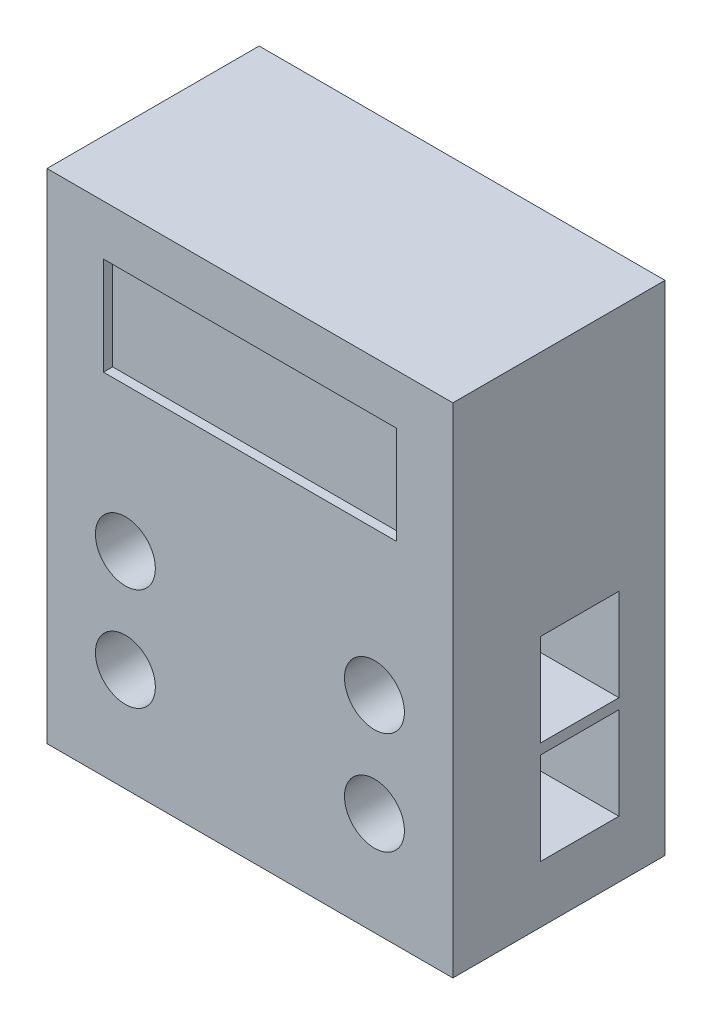
ISO-10303-21;
HEADER;
FILE_DESCRIPTION(('STEP AP214'),'2;1');
FILE_NAME('part.step','',(''),(''),'','','');
FILE_SCHEMA(('AUTOMOTIVE_DESIGN { 1 0 10303 214 1 1 1 1 }'));
ENDSEC;
DATA;
#1=APPLICATION_CONTEXT('core data for automotive mechanical design processes');
#2=APPLICATION_PROTOCOL_DEFINITION('international standard','automotive_design',2000,#1);
#3=PRODUCT_CONTEXT('',#1,'mechanical');
#4=PRODUCT('Part','Part','',(#3));
#5=PRODUCT_RELATED_PRODUCT_CATEGORY('part','',(#4));
#6=PRODUCT_DEFINITION_FORMATION('','',#4);
#7=PRODUCT_DEFINITION_CONTEXT('part definition',#1,'design');
#8=PRODUCT_DEFINITION('design','',#6,#7);
#9=PRODUCT_DEFINITION_SHAPE('','',#8);
#10=(LENGTH_UNIT() NAMED_UNIT(*) SI_UNIT(.MILLI.,.METRE.));
#11=(NAMED_UNIT(*) PLANE_ANGLE_UNIT() SI_UNIT($,.RADIAN.));
#12=(NAMED_UNIT(*) SI_UNIT($,.STERADIAN.) SOLID_ANGLE_UNIT());
#13=UNCERTAINTY_MEASURE_WITH_UNIT(LENGTH_MEASURE(1.E-05),#10,'distance_accuracy_value','');
#14=(GEOMETRIC_REPRESENTATION_CONTEXT(3) GLOBAL_UNCERTAINTY_ASSIGNED_CONTEXT((#13)) GLOBAL_UNIT_ASSIGNED_CONTEXT((#10,
#11,#12)) REPRESENTATION_CONTEXT('',''));
#15=CARTESIAN_POINT('',(0.,0.,0.));
#16=DIRECTION('',(0.,0.,1.));
#17=DIRECTION('',(1.,0.,0.));
#18=AXIS2_PLACEMENT_3D('',#15,#16,#17);
#19=CARTESIAN_POINT('',(-27.,-31.625,-46.));
#20=DIRECTION('',(0.,0.,1.));
#21=DIRECTION('',(1.,0.,0.));
#22=AXIS2_PLACEMENT_3D('',#19,#20,#21);
#23=CYLINDRICAL_SURFACE('',#22,6.5);
#24=CARTESIAN_POINT('',(-27.,-31.625,0.));
#25=DIRECTION('',(0.,0.,1.));
#26=DIRECTION('',(1.,0.,0.));
#27=AXIS2_PLACEMENT_3D('',#24,#25,#26);
#28=CIRCLE('',#27,6.5);
#29=CARTESIAN_POINT('',(-20.5,-31.625,0.));
#30=VERTEX_POINT('',#29);
#31=EDGE_CURVE('E359',#30,#30,#28,.T.);
#32=ORIENTED_EDGE('',*,*,#31,.T.);
#33=EDGE_LOOP('',(#32));
#34=FACE_BOUND('',#33,.T.);
#35=CARTESIAN_POINT('',(-27.,-31.625,-19.));
#36=DIRECTION('',(0.,0.,-1.));
#37=DIRECTION('',(0.,1.,0.));
#38=AXIS2_PLACEMENT_3D('',#35,#36,#37);
#39=CIRCLE('',#38,6.5);
#40=CARTESIAN_POINT('',(-27.,-25.125,-19.));
#41=VERTEX_POINT('',#40);
#42=EDGE_CURVE('E234',#41,#41,#39,.F.);
#43=ORIENTED_EDGE('',*,*,#42,.F.);
#44=EDGE_LOOP('',(#43));
#45=FACE_BOUND('',#44,.T.);
#46=ADVANCED_FACE('F35',(#34,#45),#23,.F.);
#47=CARTESIAN_POINT('',(27.,-31.625,-46.));
#48=DIRECTION('',(0.,0.,1.));
#49=DIRECTION('',(1.,0.,0.));
#50=AXIS2_PLACEMENT_3D('',#47,#48,#49);
#51=CYLINDRICAL_SURFACE('',#50,6.5);
#52=CARTESIAN_POINT('',(27.,-31.625,0.));
#53=DIRECTION('',(0.,0.,1.));
#54=DIRECTION('',(1.,0.,0.));
#55=AXIS2_PLACEMENT_3D('',#52,#53,#54);
#56=CIRCLE('',#55,6.5);
#57=CARTESIAN_POINT('',(33.5,-31.625,0.));
#58=VERTEX_POINT('',#57);
#59=EDGE_CURVE('E365',#58,#58,#56,.T.);
#60=ORIENTED_EDGE('',*,*,#59,.T.);
#61=EDGE_LOOP('',(#60));
#62=FACE_BOUND('',#61,.T.);
#63=CARTESIAN_POINT('',(27.,-31.625,-19.));
#64=DIRECTION('',(0.,0.,-1.));
#65=DIRECTION('',(0.,1.,0.));
#66=AXIS2_PLACEMENT_3D('',#63,#64,#65);
#67=CIRCLE('',#66,6.5);
#68=CARTESIAN_POINT('',(27.,-25.125,-19.));
#69=VERTEX_POINT('',#68);
#70=EDGE_CURVE('E333',#69,#69,#67,.F.);
#71=ORIENTED_EDGE('',*,*,#70,.F.);
#72=EDGE_LOOP('',(#71));
#73=FACE_BOUND('',#72,.T.);
#74=ADVANCED_FACE('F435',(#62,#73),#51,.F.);
#75=CARTESIAN_POINT('',(43.9998585,0.,-46.));
#76=DIRECTION('',(1.,0.,0.));
#77=DIRECTION('',(0.,0.,-1.));
#78=AXIS2_PLACEMENT_3D('',#75,#76,#77);
#79=PLANE('',#78);
#80=DIRECTION('',(0.,-1.,0.));
#81=VECTOR('',#80,1.);
#82=CARTESIAN_POINT('',(43.9998585,0.,-19.));
#83=LINE('',#82,#81);
#84=CARTESIAN_POINT('',(43.9998585,0.624999999999994,-19.));
#85=VERTEX_POINT('',#84);
#86=CARTESIAN_POINT('',(43.9998585,-19.375,-19.));
#87=VERTEX_POINT('',#86);
#88=EDGE_CURVE('E269',#85,#87,#83,.T.);
#89=ORIENTED_EDGE('',*,*,#88,.F.);
#90=DIRECTION('',(0.,0.,1.));
#91=VECTOR('',#90,1.);
#92=CARTESIAN_POINT('',(43.9998585,0.624999999999994,-46.));
#93=LINE('',#92,#91);
#94=CARTESIAN_POINT('',(43.9998585,0.624999999999994,-36.));
#95=VERTEX_POINT('',#94);
#96=EDGE_CURVE('E306',#95,#85,#93,.T.);
#97=ORIENTED_EDGE('',*,*,#96,.F.);
#98=DIRECTION('',(0.,1.,0.));
#99=VECTOR('',#98,1.);
#100=CARTESIAN_POINT('',(43.9998585,0.,-36.));
#101=LINE('',#100,#99);
#102=CARTESIAN_POINT('',(43.9998585,-19.375,-36.));
#103=VERTEX_POINT('',#102);
#104=EDGE_CURVE('E319',#103,#95,#101,.T.);
#105=ORIENTED_EDGE('',*,*,#104,.F.);
#106=DIRECTION('',(0.,0.,1.));
#107=VECTOR('',#106,1.);
#108=CARTESIAN_POINT('',(43.9998585,-19.375,-46.));
#109=LINE('',#108,#107);
#110=EDGE_CURVE('E316',#103,#87,#109,.T.);
#111=ORIENTED_EDGE('',*,*,#110,.T.);
#112=EDGE_LOOP('',(#89,#97,#105,#111));
#113=FACE_BOUND('',#112,.T.);
#114=DIRECTION('',(0.,1.,0.));
#115=VECTOR('',#114,1.);
#116=CARTESIAN_POINT('',(43.9998585,0.,0.));
#117=LINE('',#116,#115);
#118=CARTESIAN_POINT('',(43.9998585,-54.,0.));
#119=VERTEX_POINT('',#118);
#120=CARTESIAN_POINT('',(43.9998585,54.,0.));
#121=VERTEX_POINT('',#120);
#122=EDGE_CURVE('E373',#119,#121,#117,.T.);
#123=ORIENTED_EDGE('',*,*,#122,.F.);
#124=DIRECTION('',(0.,0.,1.));
#125=VECTOR('',#124,1.);
#126=CARTESIAN_POINT('',(43.9998585,-54.,-46.));
#127=LINE('',#126,#125);
#128=CARTESIAN_POINT('',(43.9998585,-54.,-46.));
#129=VERTEX_POINT('',#128);
#130=EDGE_CURVE('E398',#129,#119,#127,.T.);
#131=ORIENTED_EDGE('',*,*,#130,.F.);
#132=DIRECTION('',(0.,1.,0.));
#133=VECTOR('',#132,1.);
#134=CARTESIAN_POINT('',(43.9998585,0.,-46.));
#135=LINE('',#134,#133);
#136=CARTESIAN_POINT('',(43.9998585,54.,-46.));
#137=VERTEX_POINT('',#136);
#138=EDGE_CURVE('E351',#129,#137,#135,.T.);
#139=ORIENTED_EDGE('',*,*,#138,.T.);
#140=DIRECTION('',(0.,0.,1.));
#141=VECTOR('',#140,1.);
#142=CARTESIAN_POINT('',(43.9998585,54.,-46.));
#143=LINE('',#142,#141);
#144=EDGE_CURVE('E397',#137,#121,#143,.T.);
#145=ORIENTED_EDGE('',*,*,#144,.T.);
#146=EDGE_LOOP('',(#123,#131,#139,#145));
#147=FACE_BOUND('',#146,.T.);
#148=DIRECTION('',(0.,0.,1.));
#149=VECTOR('',#148,1.);
#150=CARTESIAN_POINT('',(43.9998585,-41.625,-46.));
#151=LINE('',#150,#149);
#152=CARTESIAN_POINT('',(43.9998585,-41.625,-36.));
#153=VERTEX_POINT('',#152);
#154=CARTESIAN_POINT('',(43.9998585,-41.625,-19.));
#155=VERTEX_POINT('',#154);
#156=EDGE_CURVE('E273',#153,#155,#151,.T.);
#157=ORIENTED_EDGE('',*,*,#156,.T.);
#158=DIRECTION('',(0.,1.,0.));
#159=VECTOR('',#158,1.);
#160=CARTESIAN_POINT('',(43.9998585,0.,-19.));
#161=LINE('',#160,#159);
#162=CARTESIAN_POINT('',(43.9998585,-21.625,-19.));
#163=VERTEX_POINT('',#162);
#164=EDGE_CURVE('E281',#155,#163,#161,.T.);
#165=ORIENTED_EDGE('',*,*,#164,.T.);
#166=DIRECTION('',(0.,0.,1.));
#167=VECTOR('',#166,1.);
#168=CARTESIAN_POINT('',(43.9998585,-21.625,-46.));
#169=LINE('',#168,#167);
#170=CARTESIAN_POINT('',(43.9998585,-21.625,-36.));
#171=VERTEX_POINT('',#170);
#172=EDGE_CURVE('E284',#171,#163,#169,.T.);
#173=ORIENTED_EDGE('',*,*,#172,.F.);
#174=DIRECTION('',(0.,-1.,0.));
#175=VECTOR('',#174,1.);
#176=CARTESIAN_POINT('',(43.9998585,0.,-36.));
#177=LINE('',#176,#175);
#178=EDGE_CURVE('E288',#171,#153,#177,.T.);
#179=ORIENTED_EDGE('',*,*,#178,.T.);
#180=EDGE_LOOP('',(#157,#165,#173,#179));
#181=FACE_BOUND('',#180,.T.);
#182=ADVANCED_FACE('F442',(#113,#147,#181),#79,.T.);
#183=CARTESIAN_POINT('',(-27.,-9.37500000000002,-46.));
#184=DIRECTION('',(0.,0.,1.));
#185=DIRECTION('',(1.,0.,0.));
#186=AXIS2_PLACEMENT_3D('',#183,#184,#185);
#187=CYLINDRICAL_SURFACE('',#186,6.5);
#188=CARTESIAN_POINT('',(-27.,-9.37500000000002,-19.));
#189=DIRECTION('',(0.,0.,1.));
#190=DIRECTION('',(0.,-1.,0.));
#191=AXIS2_PLACEMENT_3D('',#188,#189,#190);
#192=CIRCLE('',#191,6.5);
#193=CARTESIAN_POINT('',(-27.,-15.875,-19.));
#194=VERTEX_POINT('',#193);
#195=EDGE_CURVE('E266',#194,#194,#192,.F.);
#196=ORIENTED_EDGE('',*,*,#195,.T.);
#197=EDGE_LOOP('',(#196));
#198=FACE_BOUND('',#197,.T.);
#199=CARTESIAN_POINT('',(-27.,-9.37500000000002,0.));
#200=DIRECTION('',(0.,0.,1.));
#201=DIRECTION('',(1.,0.,0.));
#202=AXIS2_PLACEMENT_3D('',#199,#200,#201);
#203=CIRCLE('',#202,6.5);
#204=CARTESIAN_POINT('',(-20.5,-9.37500000000002,0.));
#205=VERTEX_POINT('',#204);
#206=EDGE_CURVE('E341',#205,#205,#203,.T.);
#207=ORIENTED_EDGE('',*,*,#206,.T.);
#208=EDGE_LOOP('',(#207));
#209=FACE_BOUND('',#208,.T.);
#210=ADVANCED_FACE('F37',(#198,#209),#187,.F.);
#211=CARTESIAN_POINT('',(27.,-9.37500000000001,-46.));
#212=DIRECTION('',(0.,0.,1.));
#213=DIRECTION('',(1.,0.,0.));
#214=AXIS2_PLACEMENT_3D('',#211,#212,#213);
#215=CYLINDRICAL_SURFACE('',#214,6.50000000000001);
#216=CARTESIAN_POINT('',(27.,-9.37500000000001,-19.));
#217=DIRECTION('',(0.,0.,1.));
#218=DIRECTION('',(0.,-1.,0.));
#219=AXIS2_PLACEMENT_3D('',#216,#217,#218);
#220=CIRCLE('',#219,6.50000000000001);
#221=CARTESIAN_POINT('',(27.,-15.875,-19.));
#222=VERTEX_POINT('',#221);
#223=EDGE_CURVE('E301',#222,#222,#220,.F.);
#224=ORIENTED_EDGE('',*,*,#223,.T.);
#225=EDGE_LOOP('',(#224));
#226=FACE_BOUND('',#225,.T.);
#227=CARTESIAN_POINT('',(27.,-9.37500000000001,0.));
#228=DIRECTION('',(0.,0.,1.));
#229=DIRECTION('',(1.,0.,0.));
#230=AXIS2_PLACEMENT_3D('',#227,#228,#229);
#231=CIRCLE('',#230,6.50000000000001);
#232=CARTESIAN_POINT('',(33.5,-9.37500000000001,0.));
#233=VERTEX_POINT('',#232);
#234=EDGE_CURVE('E362',#233,#233,#231,.T.);
#235=ORIENTED_EDGE('',*,*,#234,.T.);
#236=EDGE_LOOP('',(#235));
#237=FACE_BOUND('',#236,.T.);
#238=ADVANCED_FACE('F447',(#226,#237),#215,.F.);
#239=CARTESIAN_POINT('',(0.,43.125,-46.));
#240=DIRECTION('',(0.,-1.,0.));
#241=DIRECTION('',(0.,0.,-1.));
#242=AXIS2_PLACEMENT_3D('',#239,#240,#241);
#243=PLANE('',#242);
#244=DIRECTION('',(1.,0.,0.));
#245=VECTOR('',#244,1.);
#246=CARTESIAN_POINT('',(31.75,43.125,-2.));
#247=LINE('',#246,#245);
#248=CARTESIAN_POINT('',(-31.75,43.125,-2.));
#249=VERTEX_POINT('',#248);
#250=CARTESIAN_POINT('',(31.75,43.125,-2.));
#251=VERTEX_POINT('',#250);
#252=EDGE_CURVE('E342',#249,#251,#247,.T.);
#253=ORIENTED_EDGE('',*,*,#252,.T.);
#254=DIRECTION('',(0.,0.,1.));
#255=VECTOR('',#254,1.);
#256=CARTESIAN_POINT('',(31.75,43.125,-46.));
#257=LINE('',#256,#255);
#258=CARTESIAN_POINT('',(31.75,43.125,0.));
#259=VERTEX_POINT('',#258);
#260=EDGE_CURVE('E393',#251,#259,#257,.T.);
#261=ORIENTED_EDGE('',*,*,#260,.T.);
#262=DIRECTION('',(1.,0.,0.));
#263=VECTOR('',#262,1.);
#264=CARTESIAN_POINT('',(0.,43.125,0.));
#265=LINE('',#264,#263);
#266=CARTESIAN_POINT('',(-31.75,43.125,0.));
#267=VERTEX_POINT('',#266);
#268=EDGE_CURVE('E379',#267,#259,#265,.T.);
#269=ORIENTED_EDGE('',*,*,#268,.F.);
#270=DIRECTION('',(0.,0.,1.));
#271=VECTOR('',#270,1.);
#272=CARTESIAN_POINT('',(-31.75,43.125,-46.));
#273=LINE('',#272,#271);
#274=EDGE_CURVE('E12',#249,#267,#273,.T.);
#275=ORIENTED_EDGE('',*,*,#274,.F.);
#276=EDGE_LOOP('',(#253,#261,#269,#275));
#277=FACE_BOUND('',#276,.T.);
#278=ADVANCED_FACE('F449',(#277),#243,.T.);
#279=CARTESIAN_POINT('',(-31.75,0.,-46.));
#280=DIRECTION('',(-1.,0.,0.));
#281=DIRECTION('',(0.,-1.,0.));
#282=AXIS2_PLACEMENT_3D('',#279,#280,#281);
#283=PLANE('',#282);
#284=DIRECTION('',(0.,0.,1.));
#285=VECTOR('',#284,1.);
#286=CARTESIAN_POINT('',(-31.75,21.875,-46.));
#287=LINE('',#286,#285);
#288=CARTESIAN_POINT('',(-31.75,21.875,-2.));
#289=VERTEX_POINT('',#288);
#290=CARTESIAN_POINT('',(-31.75,21.875,0.));
#291=VERTEX_POINT('',#290);
#292=EDGE_CURVE('E44',#289,#291,#287,.T.);
#293=ORIENTED_EDGE('',*,*,#292,.F.);
#294=DIRECTION('',(0.,1.,0.));
#295=VECTOR('',#294,1.);
#296=CARTESIAN_POINT('',(-31.75,21.875,-2.));
#297=LINE('',#296,#295);
#298=EDGE_CURVE('E338',#289,#249,#297,.T.);
#299=ORIENTED_EDGE('',*,*,#298,.T.);
#300=ORIENTED_EDGE('',*,*,#274,.T.);
#301=DIRECTION('',(0.,-1.,0.));
#302=VECTOR('',#301,1.);
#303=CARTESIAN_POINT('',(-31.75,0.,0.));
#304=LINE('',#303,#302);
#305=EDGE_CURVE('E349',#267,#291,#304,.T.);
#306=ORIENTED_EDGE('',*,*,#305,.T.);
#307=EDGE_LOOP('',(#293,#299,#300,#306));
#308=FACE_BOUND('',#307,.T.);
#309=ADVANCED_FACE('F458',(#308),#283,.F.);
#310=CARTESIAN_POINT('',(0.,21.875,-46.));
#311=DIRECTION('',(0.,-1.,0.));
#312=DIRECTION('',(0.,0.,-1.));
#313=AXIS2_PLACEMENT_3D('',#310,#311,#312);
#314=PLANE('',#313);
#315=DIRECTION('',(0.,0.,1.));
#316=VECTOR('',#315,1.);
#317=CARTESIAN_POINT('',(31.75,21.875,-46.));
#318=LINE('',#317,#316);
#319=CARTESIAN_POINT('',(31.75,21.875,-2.));
#320=VERTEX_POINT('',#319);
#321=CARTESIAN_POINT('',(31.75,21.875,0.));
#322=VERTEX_POINT('',#321);
#323=EDGE_CURVE('E391',#320,#322,#318,.T.);
#324=ORIENTED_EDGE('',*,*,#323,.F.);
#325=DIRECTION('',(-1.,0.,0.));
#326=VECTOR('',#325,1.);
#327=CARTESIAN_POINT('',(31.75,21.875,-2.));
#328=LINE('',#327,#326);
#329=EDGE_CURVE('E336',#320,#289,#328,.T.);
#330=ORIENTED_EDGE('',*,*,#329,.T.);
#331=ORIENTED_EDGE('',*,*,#292,.T.);
#332=DIRECTION('',(1.,0.,0.));
#333=VECTOR('',#332,1.);
#334=CARTESIAN_POINT('',(0.,21.875,0.));
#335=LINE('',#334,#333);
#336=EDGE_CURVE('E385',#291,#322,#335,.T.);
#337=ORIENTED_EDGE('',*,*,#336,.T.);
#338=EDGE_LOOP('',(#324,#330,#331,#337));
#339=FACE_BOUND('',#338,.T.);
#340=ADVANCED_FACE('F452',(#339),#314,.F.);
#341=CARTESIAN_POINT('',(-43.9998585,0.,-46.));
#342=DIRECTION('',(1.,0.,0.));
#343=DIRECTION('',(0.,0.,-1.));
#344=AXIS2_PLACEMENT_3D('',#341,#342,#343);
#345=PLANE('',#344);
#346=DIRECTION('',(0.,0.,-1.));
#347=VECTOR('',#346,1.);
#348=CARTESIAN_POINT('',(-43.9998585,-19.375,-46.));
#349=LINE('',#348,#347);
#350=CARTESIAN_POINT('',(-43.9998585,-19.375,-19.));
#351=VERTEX_POINT('',#350);
#352=CARTESIAN_POINT('',(-43.9998585,-19.375,-36.));
#353=VERTEX_POINT('',#352);
#354=EDGE_CURVE('E227',#351,#353,#349,.T.);
#355=ORIENTED_EDGE('',*,*,#354,.T.);
#356=DIRECTION('',(0.,-1.,0.));
#357=VECTOR('',#356,1.);
#358=CARTESIAN_POINT('',(-43.9998585,0.,-36.));
#359=LINE('',#358,#357);
#360=CARTESIAN_POINT('',(-43.9998585,0.624999999999994,-36.));
#361=VERTEX_POINT('',#360);
#362=EDGE_CURVE('E52',#361,#353,#359,.T.);
#363=ORIENTED_EDGE('',*,*,#362,.F.);
#364=DIRECTION('',(0.,0.,-1.));
#365=VECTOR('',#364,1.);
#366=CARTESIAN_POINT('',(-43.9998585,0.624999999999994,-46.));
#367=LINE('',#366,#365);
#368=CARTESIAN_POINT('',(-43.9998585,0.624999999999994,-19.));
#369=VERTEX_POINT('',#368);
#370=EDGE_CURVE('E218',#369,#361,#367,.T.);
#371=ORIENTED_EDGE('',*,*,#370,.F.);
#372=DIRECTION('',(0.,1.,0.));
#373=VECTOR('',#372,1.);
#374=CARTESIAN_POINT('',(-43.9998585,0.,-19.));
#375=LINE('',#374,#373);
#376=EDGE_CURVE('E221',#351,#369,#375,.T.);
#377=ORIENTED_EDGE('',*,*,#376,.F.);
#378=EDGE_LOOP('',(#355,#363,#371,#377));
#379=FACE_BOUND('',#378,.T.);
#380=DIRECTION('',(0.,-1.,0.));
#381=VECTOR('',#380,1.);
#382=CARTESIAN_POINT('',(-43.9998585,0.,-19.));
#383=LINE('',#382,#381);
#384=CARTESIAN_POINT('',(-43.9998585,-21.625,-19.));
#385=VERTEX_POINT('',#384);
#386=CARTESIAN_POINT('',(-43.9998585,-41.625,-19.));
#387=VERTEX_POINT('',#386);
#388=EDGE_CURVE('E250',#385,#387,#383,.T.);
#389=ORIENTED_EDGE('',*,*,#388,.T.);
#390=DIRECTION('',(0.,0.,1.));
#391=VECTOR('',#390,1.);
#392=CARTESIAN_POINT('',(-43.9998585,-41.625,-46.));
#393=LINE('',#392,#391);
#394=CARTESIAN_POINT('',(-43.9998585,-41.625,-36.));
#395=VERTEX_POINT('',#394);
#396=EDGE_CURVE('E60',#395,#387,#393,.T.);
#397=ORIENTED_EDGE('',*,*,#396,.F.);
#398=DIRECTION('',(0.,1.,0.));
#399=VECTOR('',#398,1.);
#400=CARTESIAN_POINT('',(-43.9998585,0.,-36.));
#401=LINE('',#400,#399);
#402=CARTESIAN_POINT('',(-43.9998585,-21.625,-36.));
#403=VERTEX_POINT('',#402);
#404=EDGE_CURVE('E242',#395,#403,#401,.T.);
#405=ORIENTED_EDGE('',*,*,#404,.T.);
#406=DIRECTION('',(0.,0.,1.));
#407=VECTOR('',#406,1.);
#408=CARTESIAN_POINT('',(-43.9998585,-21.625,-46.));
#409=LINE('',#408,#407);
#410=EDGE_CURVE('E253',#403,#385,#409,.T.);
#411=ORIENTED_EDGE('',*,*,#410,.T.);
#412=EDGE_LOOP('',(#389,#397,#405,#411));
#413=FACE_BOUND('',#412,.T.);
#414=DIRECTION('',(0.,1.,0.));
#415=VECTOR('',#414,1.);
#416=CARTESIAN_POINT('',(-43.9998585,0.,0.));
#417=LINE('',#416,#415);
#418=CARTESIAN_POINT('',(-43.9998585,-54.,0.));
#419=VERTEX_POINT('',#418);
#420=CARTESIAN_POINT('',(-43.9998585,54.,0.));
#421=VERTEX_POINT('',#420);
#422=EDGE_CURVE('E368',#419,#421,#417,.T.);
#423=ORIENTED_EDGE('',*,*,#422,.T.);
#424=DIRECTION('',(0.,0.,1.));
#425=VECTOR('',#424,1.);
#426=CARTESIAN_POINT('',(-43.9998585,54.,-46.));
#427=LINE('',#426,#425);
#428=CARTESIAN_POINT('',(-43.9998585,54.,-46.));
#429=VERTEX_POINT('',#428);
#430=EDGE_CURVE('E395',#429,#421,#427,.T.);
#431=ORIENTED_EDGE('',*,*,#430,.F.);
#432=DIRECTION('',(0.,1.,0.));
#433=VECTOR('',#432,1.);
#434=CARTESIAN_POINT('',(-43.9998585,0.,-46.));
#435=LINE('',#434,#433);
#436=CARTESIAN_POINT('',(-43.9998585,-54.,-46.));
#437=VERTEX_POINT('',#436);
#438=EDGE_CURVE('E346',#437,#429,#435,.T.);
#439=ORIENTED_EDGE('',*,*,#438,.F.);
#440=DIRECTION('',(0.,0.,1.));
#441=VECTOR('',#440,1.);
#442=CARTESIAN_POINT('',(-43.9998585,-54.,-46.));
#443=LINE('',#442,#441);
#444=EDGE_CURVE('E39',#437,#419,#443,.T.);
#445=ORIENTED_EDGE('',*,*,#444,.T.);
#446=EDGE_LOOP('',(#423,#431,#439,#445));
#447=FACE_BOUND('',#446,.T.);
#448=ADVANCED_FACE('F407',(#379,#413,#447),#345,.F.);
#449=CARTESIAN_POINT('',(0.,54.,-46.));
#450=DIRECTION('',(0.,1.,0.));
#451=DIRECTION('',(-1.,0.,0.));
#452=AXIS2_PLACEMENT_3D('',#449,#450,#451);
#453=PLANE('',#452);
#454=DIRECTION('',(-1.,0.,0.));
#455=VECTOR('',#454,1.);
#456=CARTESIAN_POINT('',(0.,54.,0.));
#457=LINE('',#456,#455);
#458=EDGE_CURVE('E376',#121,#421,#457,.T.);
#459=ORIENTED_EDGE('',*,*,#458,.F.);
#460=ORIENTED_EDGE('',*,*,#144,.F.);
#461=DIRECTION('',(-1.,0.,0.));
#462=VECTOR('',#461,1.);
#463=CARTESIAN_POINT('',(0.,54.,-46.));
#464=LINE('',#463,#462);
#465=EDGE_CURVE('E354',#137,#429,#464,.T.);
#466=ORIENTED_EDGE('',*,*,#465,.T.);
#467=ORIENTED_EDGE('',*,*,#430,.T.);
#468=EDGE_LOOP('',(#459,#460,#466,#467));
#469=FACE_BOUND('',#468,.T.);
#470=ADVANCED_FACE('F415',(#469),#453,.T.);
#471=CARTESIAN_POINT('',(0.,-54.,-46.));
#472=DIRECTION('',(0.,1.,0.));
#473=DIRECTION('',(-1.,0.,0.));
#474=AXIS2_PLACEMENT_3D('',#471,#472,#473);
#475=PLANE('',#474);
#476=DIRECTION('',(-1.,0.,0.));
#477=VECTOR('',#476,1.);
#478=CARTESIAN_POINT('',(0.,-54.,0.));
#479=LINE('',#478,#477);
#480=EDGE_CURVE('E371',#119,#419,#479,.T.);
#481=ORIENTED_EDGE('',*,*,#480,.T.);
#482=ORIENTED_EDGE('',*,*,#444,.F.);
#483=DIRECTION('',(-1.,0.,0.));
#484=VECTOR('',#483,1.);
#485=CARTESIAN_POINT('',(0.,-54.,-46.));
#486=LINE('',#485,#484);
#487=EDGE_CURVE('E348',#129,#437,#486,.T.);
#488=ORIENTED_EDGE('',*,*,#487,.F.);
#489=ORIENTED_EDGE('',*,*,#130,.T.);
#490=EDGE_LOOP('',(#481,#482,#488,#489));
#491=FACE_BOUND('',#490,.T.);
#492=ADVANCED_FACE('F420',(#491),#475,.F.);
#493=CARTESIAN_POINT('',(31.75,0.,-46.));
#494=DIRECTION('',(-1.,0.,0.));
#495=DIRECTION('',(0.,-1.,0.));
#496=AXIS2_PLACEMENT_3D('',#493,#494,#495);
#497=PLANE('',#496);
#498=DIRECTION('',(0.,-1.,0.));
#499=VECTOR('',#498,1.);
#500=CARTESIAN_POINT('',(31.75,21.875,-2.));
#501=LINE('',#500,#499);
#502=EDGE_CURVE('E339',#251,#320,#501,.T.);
#503=ORIENTED_EDGE('',*,*,#502,.T.);
#504=ORIENTED_EDGE('',*,*,#323,.T.);
#505=DIRECTION('',(0.,-1.,0.));
#506=VECTOR('',#505,1.);
#507=CARTESIAN_POINT('',(31.75,0.,0.));
#508=LINE('',#507,#506);
#509=EDGE_CURVE('E382',#259,#322,#508,.T.);
#510=ORIENTED_EDGE('',*,*,#509,.F.);
#511=ORIENTED_EDGE('',*,*,#260,.F.);
#512=EDGE_LOOP('',(#503,#504,#510,#511));
#513=FACE_BOUND('',#512,.T.);
#514=ADVANCED_FACE('F422',(#513),#497,.T.);
#515=CARTESIAN_POINT('',(0.,0.,-46.));
#516=DIRECTION('',(0.,0.,1.));
#517=DIRECTION('',(1.,0.,0.));
#518=AXIS2_PLACEMENT_3D('',#515,#516,#517);
#519=PLANE('',#518);
#520=ORIENTED_EDGE('',*,*,#438,.T.);
#521=ORIENTED_EDGE('',*,*,#465,.F.);
#522=ORIENTED_EDGE('',*,*,#138,.F.);
#523=ORIENTED_EDGE('',*,*,#487,.T.);
#524=EDGE_LOOP('',(#520,#521,#522,#523));
#525=FACE_BOUND('',#524,.T.);
#526=ADVANCED_FACE('F419',(#525),#519,.F.);
#527=CARTESIAN_POINT('',(0.,0.,0.));
#528=DIRECTION('',(0.,0.,1.));
#529=DIRECTION('',(1.,0.,0.));
#530=AXIS2_PLACEMENT_3D('',#527,#528,#529);
#531=PLANE('',#530);
#532=ORIENTED_EDGE('',*,*,#206,.F.);
#533=EDGE_LOOP('',(#532));
#534=FACE_BOUND('',#533,.T.);
#535=ORIENTED_EDGE('',*,*,#31,.F.);
#536=EDGE_LOOP('',(#535));
#537=FACE_BOUND('',#536,.T.);
#538=ORIENTED_EDGE('',*,*,#234,.F.);
#539=EDGE_LOOP('',(#538));
#540=FACE_BOUND('',#539,.T.);
#541=ORIENTED_EDGE('',*,*,#59,.F.);
#542=EDGE_LOOP('',(#541));
#543=FACE_BOUND('',#542,.T.);
#544=ORIENTED_EDGE('',*,*,#422,.F.);
#545=ORIENTED_EDGE('',*,*,#480,.F.);
#546=ORIENTED_EDGE('',*,*,#122,.T.);
#547=ORIENTED_EDGE('',*,*,#458,.T.);
#548=EDGE_LOOP('',(#544,#545,#546,#547));
#549=FACE_BOUND('',#548,.T.);
#550=ORIENTED_EDGE('',*,*,#268,.T.);
#551=ORIENTED_EDGE('',*,*,#509,.T.);
#552=ORIENTED_EDGE('',*,*,#336,.F.);
#553=ORIENTED_EDGE('',*,*,#305,.F.);
#554=EDGE_LOOP('',(#550,#551,#552,#553));
#555=FACE_BOUND('',#554,.T.);
#556=ADVANCED_FACE('F410',(#534,#537,#540,#543,#549,#555),#531,.T.);
#557=CARTESIAN_POINT('',(0.,0.,-2.));
#558=DIRECTION('',(0.,0.,1.));
#559=DIRECTION('',(1.,0.,0.));
#560=AXIS2_PLACEMENT_3D('',#557,#558,#559);
#561=PLANE('',#560);
#562=ORIENTED_EDGE('',*,*,#502,.F.);
#563=ORIENTED_EDGE('',*,*,#252,.F.);
#564=ORIENTED_EDGE('',*,*,#298,.F.);
#565=ORIENTED_EDGE('',*,*,#329,.F.);
#566=EDGE_LOOP('',(#562,#563,#564,#565));
#567=FACE_BOUND('',#566,.T.);
#568=ADVANCED_FACE('F528',(#567),#561,.T.);
#569=CARTESIAN_POINT('',(16.9998585,0.,-19.));
#570=DIRECTION('',(0.,0.,1.));
#571=DIRECTION('',(0.,-1.,0.));
#572=AXIS2_PLACEMENT_3D('',#569,#570,#571);
#573=PLANE('',#572);
#574=ORIENTED_EDGE('',*,*,#88,.T.);
#575=DIRECTION('',(1.,0.,0.));
#576=VECTOR('',#575,1.);
#577=CARTESIAN_POINT('',(16.9998585,-19.375,-19.));
#578=LINE('',#577,#576);
#579=CARTESIAN_POINT('',(16.9998585,-19.375,-19.));
#580=VERTEX_POINT('',#579);
#581=EDGE_CURVE('E314',#580,#87,#578,.T.);
#582=ORIENTED_EDGE('',*,*,#581,.F.);
#583=DIRECTION('',(0.,-1.,0.));
#584=VECTOR('',#583,1.);
#585=CARTESIAN_POINT('',(16.9998585,0.,-19.));
#586=LINE('',#585,#584);
#587=CARTESIAN_POINT('',(16.9998585,0.624999999999994,-19.));
#588=VERTEX_POINT('',#587);
#589=EDGE_CURVE('E302',#588,#580,#586,.T.);
#590=ORIENTED_EDGE('',*,*,#589,.F.);
#591=DIRECTION('',(1.,0.,0.));
#592=VECTOR('',#591,1.);
#593=CARTESIAN_POINT('',(16.9998585,0.624999999999994,-19.));
#594=LINE('',#593,#592);
#595=EDGE_CURVE('E285',#588,#85,#594,.T.);
#596=ORIENTED_EDGE('',*,*,#595,.T.);
#597=EDGE_LOOP('',(#574,#582,#590,#596));
#598=FACE_BOUND('',#597,.T.);
#599=ORIENTED_EDGE('',*,*,#223,.F.);
#600=EDGE_LOOP('',(#599));
#601=FACE_BOUND('',#600,.T.);
#602=ADVANCED_FACE('F521',(#598,#601),#573,.F.);
#603=CARTESIAN_POINT('',(16.9998585,0.624999999999994,-46.));
#604=DIRECTION('',(0.,1.,0.));
#605=DIRECTION('',(0.,0.,1.));
#606=AXIS2_PLACEMENT_3D('',#603,#604,#605);
#607=PLANE('',#606);
#608=ORIENTED_EDGE('',*,*,#96,.T.);
#609=ORIENTED_EDGE('',*,*,#595,.F.);
#610=DIRECTION('',(0.,0.,1.));
#611=VECTOR('',#610,1.);
#612=CARTESIAN_POINT('',(16.9998585,0.624999999999994,-46.));
#613=LINE('',#612,#611);
#614=CARTESIAN_POINT('',(16.9998585,0.624999999999994,-36.));
#615=VERTEX_POINT('',#614);
#616=EDGE_CURVE('E311',#615,#588,#613,.T.);
#617=ORIENTED_EDGE('',*,*,#616,.F.);
#618=DIRECTION('',(1.,0.,0.));
#619=VECTOR('',#618,1.);
#620=CARTESIAN_POINT('',(16.9998585,0.624999999999994,-36.));
#621=LINE('',#620,#619);
#622=EDGE_CURVE('E325',#615,#95,#621,.T.);
#623=ORIENTED_EDGE('',*,*,#622,.T.);
#624=EDGE_LOOP('',(#608,#609,#617,#623));
#625=FACE_BOUND('',#624,.T.);
#626=ADVANCED_FACE('F518',(#625),#607,.F.);
#627=CARTESIAN_POINT('',(16.9998585,-19.375,-46.));
#628=DIRECTION('',(0.,1.,0.));
#629=DIRECTION('',(0.,0.,1.));
#630=AXIS2_PLACEMENT_3D('',#627,#628,#629);
#631=PLANE('',#630);
#632=ORIENTED_EDGE('',*,*,#110,.F.);
#633=DIRECTION('',(1.,0.,0.));
#634=VECTOR('',#633,1.);
#635=CARTESIAN_POINT('',(16.9998585,-19.375,-36.));
#636=LINE('',#635,#634);
#637=CARTESIAN_POINT('',(16.9998585,-19.375,-36.));
#638=VERTEX_POINT('',#637);
#639=EDGE_CURVE('E327',#638,#103,#636,.T.);
#640=ORIENTED_EDGE('',*,*,#639,.F.);
#641=DIRECTION('',(0.,0.,1.));
#642=VECTOR('',#641,1.);
#643=CARTESIAN_POINT('',(16.9998585,-19.375,-46.));
#644=LINE('',#643,#642);
#645=EDGE_CURVE('E305',#638,#580,#644,.T.);
#646=ORIENTED_EDGE('',*,*,#645,.T.);
#647=ORIENTED_EDGE('',*,*,#581,.T.);
#648=EDGE_LOOP('',(#632,#640,#646,#647));
#649=FACE_BOUND('',#648,.T.);
#650=ADVANCED_FACE('F516',(#649),#631,.T.);
#651=CARTESIAN_POINT('',(16.9998585,0.,0.));
#652=DIRECTION('',(-1.,0.,0.));
#653=DIRECTION('',(0.,0.,1.));
#654=AXIS2_PLACEMENT_3D('',#651,#652,#653);
#655=PLANE('',#654);
#656=ORIENTED_EDGE('',*,*,#589,.T.);
#657=ORIENTED_EDGE('',*,*,#645,.F.);
#658=DIRECTION('',(0.,1.,0.));
#659=VECTOR('',#658,1.);
#660=CARTESIAN_POINT('',(16.9998585,0.,-36.));
#661=LINE('',#660,#659);
#662=EDGE_CURVE('E308',#638,#615,#661,.T.);
#663=ORIENTED_EDGE('',*,*,#662,.T.);
#664=ORIENTED_EDGE('',*,*,#616,.T.);
#665=EDGE_LOOP('',(#656,#657,#663,#664));
#666=FACE_BOUND('',#665,.T.);
#667=ADVANCED_FACE('F512',(#666),#655,.F.);
#668=CARTESIAN_POINT('',(16.9998585,0.,-19.));
#669=DIRECTION('',(0.,0.,-1.));
#670=DIRECTION('',(0.,1.,0.));
#671=AXIS2_PLACEMENT_3D('',#668,#669,#670);
#672=PLANE('',#671);
#673=ORIENTED_EDGE('',*,*,#164,.F.);
#674=DIRECTION('',(1.,0.,0.));
#675=VECTOR('',#674,1.);
#676=CARTESIAN_POINT('',(16.9998585,-41.625,-19.));
#677=LINE('',#676,#675);
#678=CARTESIAN_POINT('',(16.9998585,-41.625,-19.));
#679=VERTEX_POINT('',#678);
#680=EDGE_CURVE('E280',#679,#155,#677,.T.);
#681=ORIENTED_EDGE('',*,*,#680,.F.);
#682=DIRECTION('',(0.,1.,0.));
#683=VECTOR('',#682,1.);
#684=CARTESIAN_POINT('',(16.9998585,0.,-19.));
#685=LINE('',#684,#683);
#686=CARTESIAN_POINT('',(16.9998585,-21.625,-19.));
#687=VERTEX_POINT('',#686);
#688=EDGE_CURVE('E270',#679,#687,#685,.T.);
#689=ORIENTED_EDGE('',*,*,#688,.T.);
#690=DIRECTION('',(1.,0.,0.));
#691=VECTOR('',#690,1.);
#692=CARTESIAN_POINT('',(16.9998585,-21.625,-19.));
#693=LINE('',#692,#691);
#694=EDGE_CURVE('E299',#687,#163,#693,.T.);
#695=ORIENTED_EDGE('',*,*,#694,.T.);
#696=EDGE_LOOP('',(#673,#681,#689,#695));
#697=FACE_BOUND('',#696,.T.);
#698=ORIENTED_EDGE('',*,*,#70,.T.);
#699=EDGE_LOOP('',(#698));
#700=FACE_BOUND('',#699,.T.);
#701=ADVANCED_FACE('F508',(#697,#700),#672,.T.);
#702=CARTESIAN_POINT('',(16.9998585,-21.625,-46.));
#703=DIRECTION('',(0.,1.,0.));
#704=DIRECTION('',(0.,0.,1.));
#705=AXIS2_PLACEMENT_3D('',#702,#703,#704);
#706=PLANE('',#705);
#707=ORIENTED_EDGE('',*,*,#172,.T.);
#708=ORIENTED_EDGE('',*,*,#694,.F.);
#709=DIRECTION('',(0.,0.,1.));
#710=VECTOR('',#709,1.);
#711=CARTESIAN_POINT('',(16.9998585,-21.625,-46.));
#712=LINE('',#711,#710);
#713=CARTESIAN_POINT('',(16.9998585,-21.625,-36.));
#714=VERTEX_POINT('',#713);
#715=EDGE_CURVE('E272',#714,#687,#712,.T.);
#716=ORIENTED_EDGE('',*,*,#715,.F.);
#717=DIRECTION('',(1.,0.,0.));
#718=VECTOR('',#717,1.);
#719=CARTESIAN_POINT('',(16.9998585,-21.625,-36.));
#720=LINE('',#719,#718);
#721=EDGE_CURVE('E297',#714,#171,#720,.T.);
#722=ORIENTED_EDGE('',*,*,#721,.T.);
#723=EDGE_LOOP('',(#707,#708,#716,#722));
#724=FACE_BOUND('',#723,.T.);
#725=ADVANCED_FACE('F504',(#724),#706,.F.);
#726=CARTESIAN_POINT('',(16.9998585,-41.625,-46.));
#727=DIRECTION('',(0.,1.,0.));
#728=DIRECTION('',(0.,0.,1.));
#729=AXIS2_PLACEMENT_3D('',#726,#727,#728);
#730=PLANE('',#729);
#731=ORIENTED_EDGE('',*,*,#156,.F.);
#732=DIRECTION('',(1.,0.,0.));
#733=VECTOR('',#732,1.);
#734=CARTESIAN_POINT('',(16.9998585,-41.625,-36.));
#735=LINE('',#734,#733);
#736=CARTESIAN_POINT('',(16.9998585,-41.625,-36.));
#737=VERTEX_POINT('',#736);
#738=EDGE_CURVE('E295',#737,#153,#735,.T.);
#739=ORIENTED_EDGE('',*,*,#738,.F.);
#740=DIRECTION('',(0.,0.,1.));
#741=VECTOR('',#740,1.);
#742=CARTESIAN_POINT('',(16.9998585,-41.625,-46.));
#743=LINE('',#742,#741);
#744=EDGE_CURVE('E278',#737,#679,#743,.T.);
#745=ORIENTED_EDGE('',*,*,#744,.T.);
#746=ORIENTED_EDGE('',*,*,#680,.T.);
#747=EDGE_LOOP('',(#731,#739,#745,#746));
#748=FACE_BOUND('',#747,.T.);
#749=ADVANCED_FACE('F500',(#748),#730,.T.);
#750=CARTESIAN_POINT('',(16.9998585,0.,0.));
#751=DIRECTION('',(1.,0.,0.));
#752=DIRECTION('',(0.,0.,-1.));
#753=AXIS2_PLACEMENT_3D('',#750,#751,#752);
#754=PLANE('',#753);
#755=ORIENTED_EDGE('',*,*,#688,.F.);
#756=ORIENTED_EDGE('',*,*,#744,.F.);
#757=DIRECTION('',(0.,-1.,0.));
#758=VECTOR('',#757,1.);
#759=CARTESIAN_POINT('',(16.9998585,0.,-36.));
#760=LINE('',#759,#758);
#761=EDGE_CURVE('E276',#714,#737,#760,.T.);
#762=ORIENTED_EDGE('',*,*,#761,.F.);
#763=ORIENTED_EDGE('',*,*,#715,.T.);
#764=EDGE_LOOP('',(#755,#756,#762,#763));
#765=FACE_BOUND('',#764,.T.);
#766=ADVANCED_FACE('F496',(#765),#754,.T.);
#767=CARTESIAN_POINT('',(27.,-9.37500000000001,-36.));
#768=DIRECTION('',(0.,0.,-1.));
#769=DIRECTION('',(-1.,0.,0.));
#770=AXIS2_PLACEMENT_3D('',#767,#768,#769);
#771=PLANE('',#770);
#772=ORIENTED_EDGE('',*,*,#104,.T.);
#773=ORIENTED_EDGE('',*,*,#622,.F.);
#774=ORIENTED_EDGE('',*,*,#662,.F.);
#775=ORIENTED_EDGE('',*,*,#639,.T.);
#776=EDGE_LOOP('',(#772,#773,#774,#775));
#777=FACE_BOUND('',#776,.T.);
#778=ADVANCED_FACE('F499',(#777),#771,.F.);
#779=CARTESIAN_POINT('',(27.,-31.625,-36.));
#780=DIRECTION('',(0.,0.,-1.));
#781=DIRECTION('',(-1.,0.,0.));
#782=AXIS2_PLACEMENT_3D('',#779,#780,#781);
#783=PLANE('',#782);
#784=ORIENTED_EDGE('',*,*,#178,.F.);
#785=ORIENTED_EDGE('',*,*,#721,.F.);
#786=ORIENTED_EDGE('',*,*,#761,.T.);
#787=ORIENTED_EDGE('',*,*,#738,.T.);
#788=EDGE_LOOP('',(#784,#785,#786,#787));
#789=FACE_BOUND('',#788,.T.);
#790=ADVANCED_FACE('F494',(#789),#783,.F.);
#791=CARTESIAN_POINT('',(-16.9998585,0.,-19.));
#792=DIRECTION('',(0.,0.,-1.));
#793=DIRECTION('',(0.,1.,0.));
#794=AXIS2_PLACEMENT_3D('',#791,#792,#793);
#795=PLANE('',#794);
#796=ORIENTED_EDGE('',*,*,#388,.F.);
#797=DIRECTION('',(-1.,0.,0.));
#798=VECTOR('',#797,1.);
#799=CARTESIAN_POINT('',(-16.9998585,-21.625,-19.));
#800=LINE('',#799,#798);
#801=CARTESIAN_POINT('',(-16.9998585,-21.625,-19.));
#802=VERTEX_POINT('',#801);
#803=EDGE_CURVE('E261',#802,#385,#800,.T.);
#804=ORIENTED_EDGE('',*,*,#803,.F.);
#805=DIRECTION('',(0.,-1.,0.));
#806=VECTOR('',#805,1.);
#807=CARTESIAN_POINT('',(-16.9998585,0.,-19.));
#808=LINE('',#807,#806);
#809=CARTESIAN_POINT('',(-16.9998585,-41.625,-19.));
#810=VERTEX_POINT('',#809);
#811=EDGE_CURVE('E241',#802,#810,#808,.T.);
#812=ORIENTED_EDGE('',*,*,#811,.T.);
#813=DIRECTION('',(-1.,0.,0.));
#814=VECTOR('',#813,1.);
#815=CARTESIAN_POINT('',(-16.9998585,-41.625,-19.));
#816=LINE('',#815,#814);
#817=EDGE_CURVE('E248',#810,#387,#816,.T.);
#818=ORIENTED_EDGE('',*,*,#817,.T.);
#819=EDGE_LOOP('',(#796,#804,#812,#818));
#820=FACE_BOUND('',#819,.T.);
#821=ORIENTED_EDGE('',*,*,#42,.T.);
#822=EDGE_LOOP('',(#821));
#823=FACE_BOUND('',#822,.T.);
#824=ADVANCED_FACE('F467',(#820,#823),#795,.T.);
#825=CARTESIAN_POINT('',(-16.9998585,-41.625,-46.));
#826=DIRECTION('',(0.,-1.,0.));
#827=DIRECTION('',(0.,0.,-1.));
#828=AXIS2_PLACEMENT_3D('',#825,#826,#827);
#829=PLANE('',#828);
#830=ORIENTED_EDGE('',*,*,#396,.T.);
#831=ORIENTED_EDGE('',*,*,#817,.F.);
#832=DIRECTION('',(0.,0.,1.));
#833=VECTOR('',#832,1.);
#834=CARTESIAN_POINT('',(-16.9998585,-41.625,-46.));
#835=LINE('',#834,#833);
#836=CARTESIAN_POINT('',(-16.9998585,-41.625,-36.));
#837=VERTEX_POINT('',#836);
#838=EDGE_CURVE('E238',#837,#810,#835,.T.);
#839=ORIENTED_EDGE('',*,*,#838,.F.);
#840=DIRECTION('',(-1.,0.,0.));
#841=VECTOR('',#840,1.);
#842=CARTESIAN_POINT('',(-16.9998585,-41.625,-36.));
#843=LINE('',#842,#841);
#844=EDGE_CURVE('E228',#837,#395,#843,.T.);
#845=ORIENTED_EDGE('',*,*,#844,.T.);
#846=EDGE_LOOP('',(#830,#831,#839,#845));
#847=FACE_BOUND('',#846,.T.);
#848=ADVANCED_FACE('F471',(#847),#829,.F.);
#849=CARTESIAN_POINT('',(-16.9998585,-21.625,-46.));
#850=DIRECTION('',(0.,-1.,0.));
#851=DIRECTION('',(0.,0.,-1.));
#852=AXIS2_PLACEMENT_3D('',#849,#850,#851);
#853=PLANE('',#852);
#854=ORIENTED_EDGE('',*,*,#410,.F.);
#855=DIRECTION('',(-1.,0.,0.));
#856=VECTOR('',#855,1.);
#857=CARTESIAN_POINT('',(-16.9998585,-21.625,-36.));
#858=LINE('',#857,#856);
#859=CARTESIAN_POINT('',(-16.9998585,-21.625,-36.));
#860=VERTEX_POINT('',#859);
#861=EDGE_CURVE('E259',#860,#403,#858,.T.);
#862=ORIENTED_EDGE('',*,*,#861,.F.);
#863=DIRECTION('',(0.,0.,1.));
#864=VECTOR('',#863,1.);
#865=CARTESIAN_POINT('',(-16.9998585,-21.625,-46.));
#866=LINE('',#865,#864);
#867=EDGE_CURVE('E244',#860,#802,#866,.T.);
#868=ORIENTED_EDGE('',*,*,#867,.T.);
#869=ORIENTED_EDGE('',*,*,#803,.T.);
#870=EDGE_LOOP('',(#854,#862,#868,#869));
#871=FACE_BOUND('',#870,.T.);
#872=ADVANCED_FACE('F481',(#871),#853,.T.);
#873=CARTESIAN_POINT('',(-16.9998585,0.,0.));
#874=DIRECTION('',(1.,0.,0.));
#875=DIRECTION('',(0.,0.,-1.));
#876=AXIS2_PLACEMENT_3D('',#873,#874,#875);
#877=PLANE('',#876);
#878=ORIENTED_EDGE('',*,*,#838,.T.);
#879=ORIENTED_EDGE('',*,*,#811,.F.);
#880=ORIENTED_EDGE('',*,*,#867,.F.);
#881=DIRECTION('',(0.,1.,0.));
#882=VECTOR('',#881,1.);
#883=CARTESIAN_POINT('',(-16.9998585,0.,-36.));
#884=LINE('',#883,#882);
#885=EDGE_CURVE('E246',#837,#860,#884,.T.);
#886=ORIENTED_EDGE('',*,*,#885,.F.);
#887=EDGE_LOOP('',(#878,#879,#880,#886));
#888=FACE_BOUND('',#887,.T.);
#889=ADVANCED_FACE('F474',(#888),#877,.F.);
#890=CARTESIAN_POINT('',(-16.9998585,0.,-19.));
#891=DIRECTION('',(0.,0.,1.));
#892=DIRECTION('',(0.,-1.,0.));
#893=AXIS2_PLACEMENT_3D('',#890,#891,#892);
#894=PLANE('',#893);
#895=ORIENTED_EDGE('',*,*,#376,.T.);
#896=DIRECTION('',(-1.,0.,0.));
#897=VECTOR('',#896,1.);
#898=CARTESIAN_POINT('',(-16.9998585,0.624999999999994,-19.));
#899=LINE('',#898,#897);
#900=CARTESIAN_POINT('',(-16.9998585,0.624999999999994,-19.));
#901=VERTEX_POINT('',#900);
#902=EDGE_CURVE('E235',#901,#369,#899,.T.);
#903=ORIENTED_EDGE('',*,*,#902,.F.);
#904=DIRECTION('',(0.,1.,0.));
#905=VECTOR('',#904,1.);
#906=CARTESIAN_POINT('',(-16.9998585,0.,-19.));
#907=LINE('',#906,#905);
#908=CARTESIAN_POINT('',(-16.9998585,-19.375,-19.));
#909=VERTEX_POINT('',#908);
#910=EDGE_CURVE('E208',#909,#901,#907,.T.);
#911=ORIENTED_EDGE('',*,*,#910,.F.);
#912=DIRECTION('',(-1.,0.,0.));
#913=VECTOR('',#912,1.);
#914=CARTESIAN_POINT('',(-16.9998585,-19.375,-19.));
#915=LINE('',#914,#913);
#916=EDGE_CURVE('E203',#909,#351,#915,.T.);
#917=ORIENTED_EDGE('',*,*,#916,.T.);
#918=EDGE_LOOP('',(#895,#903,#911,#917));
#919=FACE_BOUND('',#918,.T.);
#920=ORIENTED_EDGE('',*,*,#195,.F.);
#921=EDGE_LOOP('',(#920));
#922=FACE_BOUND('',#921,.T.);
#923=ADVANCED_FACE('F488',(#919,#922),#894,.F.);
#924=CARTESIAN_POINT('',(-16.9998585,0.624999999999994,-46.));
#925=DIRECTION('',(0.,1.,0.));
#926=DIRECTION('',(0.,0.,1.));
#927=AXIS2_PLACEMENT_3D('',#924,#925,#926);
#928=PLANE('',#927);
#929=ORIENTED_EDGE('',*,*,#370,.T.);
#930=DIRECTION('',(-1.,0.,0.));
#931=VECTOR('',#930,1.);
#932=CARTESIAN_POINT('',(-16.9998585,0.624999999999994,-36.));
#933=LINE('',#932,#931);
#934=CARTESIAN_POINT('',(-16.9998585,0.624999999999994,-36.));
#935=VERTEX_POINT('',#934);
#936=EDGE_CURVE('E232',#935,#361,#933,.T.);
#937=ORIENTED_EDGE('',*,*,#936,.F.);
#938=DIRECTION('',(0.,0.,-1.));
#939=VECTOR('',#938,1.);
#940=CARTESIAN_POINT('',(-16.9998585,0.624999999999994,-46.));
#941=LINE('',#940,#939);
#942=EDGE_CURVE('E214',#901,#935,#941,.T.);
#943=ORIENTED_EDGE('',*,*,#942,.F.);
#944=ORIENTED_EDGE('',*,*,#902,.T.);
#945=EDGE_LOOP('',(#929,#937,#943,#944));
#946=FACE_BOUND('',#945,.T.);
#947=ADVANCED_FACE('F598',(#946),#928,.F.);
#948=CARTESIAN_POINT('',(-16.9998585,-19.375,-46.));
#949=DIRECTION('',(0.,1.,0.));
#950=DIRECTION('',(0.,0.,1.));
#951=AXIS2_PLACEMENT_3D('',#948,#949,#950);
#952=PLANE('',#951);
#953=ORIENTED_EDGE('',*,*,#354,.F.);
#954=ORIENTED_EDGE('',*,*,#916,.F.);
#955=DIRECTION('',(0.,0.,-1.));
#956=VECTOR('',#955,1.);
#957=CARTESIAN_POINT('',(-16.9998585,-19.375,-46.));
#958=LINE('',#957,#956);
#959=CARTESIAN_POINT('',(-16.9998585,-19.375,-36.));
#960=VERTEX_POINT('',#959);
#961=EDGE_CURVE('E198',#909,#960,#958,.T.);
#962=ORIENTED_EDGE('',*,*,#961,.T.);
#963=DIRECTION('',(-1.,0.,0.));
#964=VECTOR('',#963,1.);
#965=CARTESIAN_POINT('',(-16.9998585,-19.375,-36.));
#966=LINE('',#965,#964);
#967=EDGE_CURVE('E201',#960,#353,#966,.T.);
#968=ORIENTED_EDGE('',*,*,#967,.T.);
#969=EDGE_LOOP('',(#953,#954,#962,#968));
#970=FACE_BOUND('',#969,.T.);
#971=ADVANCED_FACE('F200',(#970),#952,.T.);
#972=CARTESIAN_POINT('',(-16.9998585,0.,0.));
#973=DIRECTION('',(1.,0.,0.));
#974=DIRECTION('',(0.,0.,-1.));
#975=AXIS2_PLACEMENT_3D('',#972,#973,#974);
#976=PLANE('',#975);
#977=DIRECTION('',(0.,-1.,0.));
#978=VECTOR('',#977,1.);
#979=CARTESIAN_POINT('',(-16.9998585,0.,-36.));
#980=LINE('',#979,#978);
#981=EDGE_CURVE('E209',#935,#960,#980,.T.);
#982=ORIENTED_EDGE('',*,*,#981,.T.);
#983=ORIENTED_EDGE('',*,*,#961,.F.);
#984=ORIENTED_EDGE('',*,*,#910,.T.);
#985=ORIENTED_EDGE('',*,*,#942,.T.);
#986=EDGE_LOOP('',(#982,#983,#984,#985));
#987=FACE_BOUND('',#986,.T.);
#988=ADVANCED_FACE('F216',(#987),#976,.F.);
#989=CARTESIAN_POINT('',(-27.,-31.625,-36.));
#990=DIRECTION('',(0.,0.,-1.));
#991=DIRECTION('',(-1.,0.,0.));
#992=AXIS2_PLACEMENT_3D('',#989,#990,#991);
#993=PLANE('',#992);
#994=ORIENTED_EDGE('',*,*,#404,.F.);
#995=ORIENTED_EDGE('',*,*,#844,.F.);
#996=ORIENTED_EDGE('',*,*,#885,.T.);
#997=ORIENTED_EDGE('',*,*,#861,.T.);
#998=EDGE_LOOP('',(#994,#995,#996,#997));
#999=FACE_BOUND('',#998,.T.);
#1000=ADVANCED_FACE('F479',(#999),#993,.F.);
#1001=CARTESIAN_POINT('',(-27.,-9.37500000000002,-36.));
#1002=DIRECTION('',(0.,0.,-1.));
#1003=DIRECTION('',(-1.,0.,0.));
#1004=AXIS2_PLACEMENT_3D('',#1001,#1002,#1003);
#1005=PLANE('',#1004);
#1006=ORIENTED_EDGE('',*,*,#362,.T.);
#1007=ORIENTED_EDGE('',*,*,#967,.F.);
#1008=ORIENTED_EDGE('',*,*,#981,.F.);
#1009=ORIENTED_EDGE('',*,*,#936,.T.);
#1010=EDGE_LOOP('',(#1006,#1007,#1008,#1009));
#1011=FACE_BOUND('',#1010,.T.);
#1012=ADVANCED_FACE('F212',(#1011),#1005,.F.);
#1013=CLOSED_SHELL('',(#46,#74,#182,#210,#238,#278,#309,#340,#448,#470,#492,#514,#526,#556,#568,
#602,#626,#650,#667,#701,#725,#749,#766,#778,#790,#824,#848,#872,#889,#923,#947,#971,#988,#1000,#1012));
#1014=MANIFOLD_SOLID_BREP('B2',#1013);
#1015=ADVANCED_BREP_SHAPE_REPRESENTATION('',(#18,#1014),#14);
#1016=SHAPE_DEFINITION_REPRESENTATION(#9,#1015);
ENDSEC;
END-ISO-10303-21;
